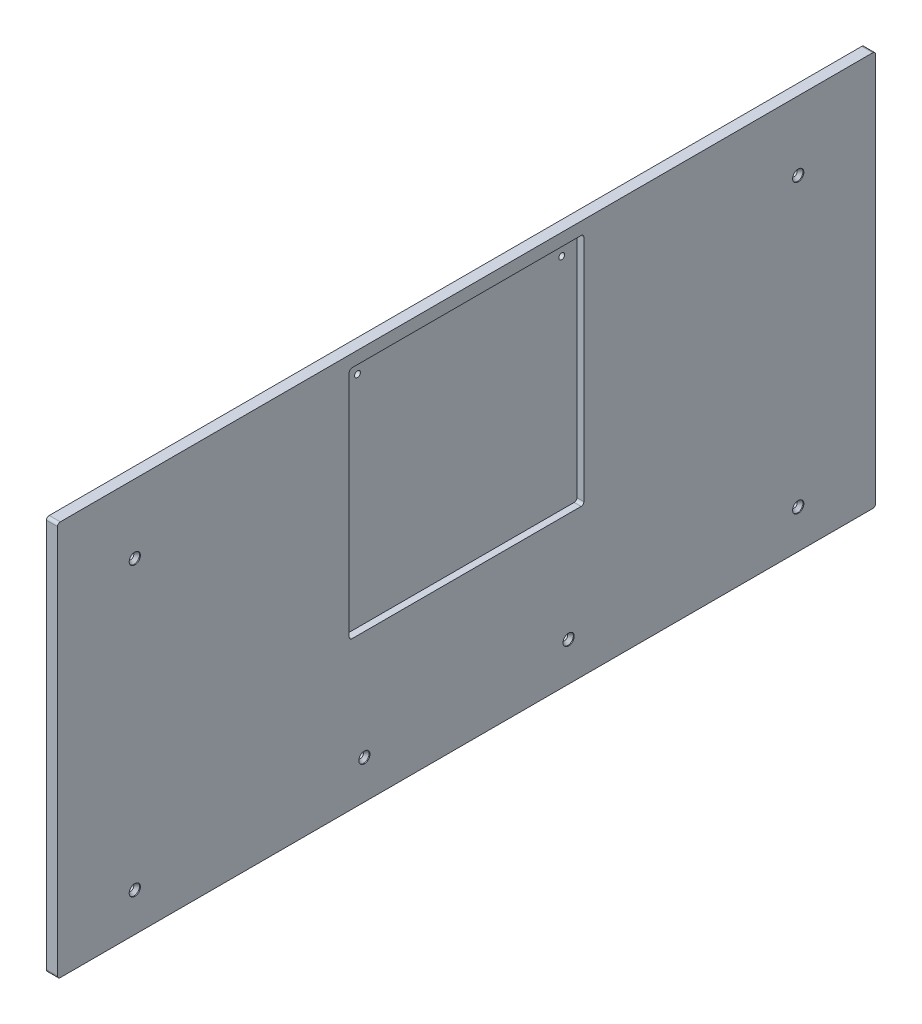
ISO-10303-21;
HEADER;
FILE_DESCRIPTION(('STEP AP214'),'2;1');
FILE_NAME('part.step','',(''),(''),'','','');
FILE_SCHEMA(('AUTOMOTIVE_DESIGN { 1 0 10303 214 1 1 1 1 }'));
ENDSEC;
DATA;
#1=APPLICATION_CONTEXT('core data for automotive mechanical design processes');
#2=APPLICATION_PROTOCOL_DEFINITION('international standard','automotive_design',2000,#1);
#3=PRODUCT_CONTEXT('',#1,'mechanical');
#4=PRODUCT('Part','Part','',(#3));
#5=PRODUCT_RELATED_PRODUCT_CATEGORY('part','',(#4));
#6=PRODUCT_DEFINITION_FORMATION('','',#4);
#7=PRODUCT_DEFINITION_CONTEXT('part definition',#1,'design');
#8=PRODUCT_DEFINITION('design','',#6,#7);
#9=PRODUCT_DEFINITION_SHAPE('','',#8);
#10=(LENGTH_UNIT() NAMED_UNIT(*) SI_UNIT(.MILLI.,.METRE.));
#11=(NAMED_UNIT(*) PLANE_ANGLE_UNIT() SI_UNIT($,.RADIAN.));
#12=(NAMED_UNIT(*) SI_UNIT($,.STERADIAN.) SOLID_ANGLE_UNIT());
#13=UNCERTAINTY_MEASURE_WITH_UNIT(LENGTH_MEASURE(1.E-05),#10,'distance_accuracy_value','');
#14=(GEOMETRIC_REPRESENTATION_CONTEXT(3) GLOBAL_UNCERTAINTY_ASSIGNED_CONTEXT((#13)) GLOBAL_UNIT_ASSIGNED_CONTEXT((#10,
#11,#12)) REPRESENTATION_CONTEXT('',''));
#15=CARTESIAN_POINT('',(0.,0.,0.));
#16=DIRECTION('',(0.,0.,1.));
#17=DIRECTION('',(1.,0.,0.));
#18=AXIS2_PLACEMENT_3D('',#15,#16,#17);
#19=CARTESIAN_POINT('',(0.,0.,0.));
#20=DIRECTION('',(-1.,0.,0.));
#21=DIRECTION('',(0.,0.,1.));
#22=AXIS2_PLACEMENT_3D('',#19,#20,#21);
#23=PLANE('',#22);
#24=CARTESIAN_POINT('',(0.,374.65,-88.9));
#25=DIRECTION('',(1.,0.,0.));
#26=DIRECTION('',(0.,0.,-1.));
#27=AXIS2_PLACEMENT_3D('',#24,#25,#26);
#28=CIRCLE('',#27,3.3782);
#29=CARTESIAN_POINT('',(0.,374.65,-92.2782));
#30=VERTEX_POINT('',#29);
#31=EDGE_CURVE('E516',#30,#30,#28,.T.);
#32=ORIENTED_EDGE('',*,*,#31,.T.);
#33=EDGE_LOOP('',(#32));
#34=FACE_BOUND('',#33,.T.);
#35=CARTESIAN_POINT('',(0.,374.65,-851.98204));
#36=DIRECTION('',(1.,0.,0.));
#37=DIRECTION('',(0.,0.,-1.));
#38=AXIS2_PLACEMENT_3D('',#35,#36,#37);
#39=CIRCLE('',#38,3.3782);
#40=CARTESIAN_POINT('',(0.,374.65,-855.36024));
#41=VERTEX_POINT('',#40);
#42=EDGE_CURVE('E531',#41,#41,#39,.T.);
#43=ORIENTED_EDGE('',*,*,#42,.T.);
#44=EDGE_LOOP('',(#43));
#45=FACE_BOUND('',#44,.T.);
#46=CARTESIAN_POINT('',(0.,44.45,-88.9));
#47=DIRECTION('',(1.,0.,0.));
#48=DIRECTION('',(0.,0.,-1.));
#49=AXIS2_PLACEMENT_3D('',#46,#47,#48);
#50=CIRCLE('',#49,3.3782);
#51=CARTESIAN_POINT('',(0.,44.45,-92.2782));
#52=VERTEX_POINT('',#51);
#53=EDGE_CURVE('E547',#52,#52,#50,.T.);
#54=ORIENTED_EDGE('',*,*,#53,.T.);
#55=EDGE_LOOP('',(#54));
#56=FACE_BOUND('',#55,.T.);
#57=CARTESIAN_POINT('',(0.,44.45,-352.96602));
#58=DIRECTION('',(1.,0.,0.));
#59=DIRECTION('',(0.,0.,-1.));
#60=AXIS2_PLACEMENT_3D('',#57,#58,#59);
#61=CIRCLE('',#60,3.3782);
#62=CARTESIAN_POINT('',(0.,44.45,-356.34422));
#63=VERTEX_POINT('',#62);
#64=EDGE_CURVE('E563',#63,#63,#61,.T.);
#65=ORIENTED_EDGE('',*,*,#64,.T.);
#66=EDGE_LOOP('',(#65));
#67=FACE_BOUND('',#66,.T.);
#68=CARTESIAN_POINT('',(0.,422.275,-587.91602));
#69=DIRECTION('',(1.,0.,0.));
#70=DIRECTION('',(0.,0.,-1.));
#71=AXIS2_PLACEMENT_3D('',#68,#69,#70);
#72=CIRCLE('',#71,3.37343749999991);
#73=CARTESIAN_POINT('',(0.,422.275,-591.2894575));
#74=VERTEX_POINT('',#73);
#75=EDGE_CURVE('E345',#74,#74,#72,.T.);
#76=ORIENTED_EDGE('',*,*,#75,.T.);
#77=EDGE_LOOP('',(#76));
#78=FACE_BOUND('',#77,.T.);
#79=DIRECTION('',(0.,0.,1.));
#80=VECTOR('',#79,1.);
#81=CARTESIAN_POINT('',(0.,454.025,0.));
#82=LINE('',#81,#80);
#83=CARTESIAN_POINT('',(0.,454.025,-937.70704));
#84=VERTEX_POINT('',#83);
#85=CARTESIAN_POINT('',(0.,454.025,-3.175));
#86=VERTEX_POINT('',#85);
#87=EDGE_CURVE('E176',#84,#86,#82,.T.);
#88=ORIENTED_EDGE('',*,*,#87,.F.);
#89=CARTESIAN_POINT('',(0.,450.85,-937.70704));
#90=DIRECTION('',(-1.,0.,0.));
#91=DIRECTION('',(0.,0.,1.));
#92=AXIS2_PLACEMENT_3D('',#89,#90,#91);
#93=CIRCLE('',#92,3.175);
#94=CARTESIAN_POINT('',(0.,450.85,-940.88204));
#95=VERTEX_POINT('',#94);
#96=EDGE_CURVE('E158',#84,#95,#93,.T.);
#97=ORIENTED_EDGE('',*,*,#96,.T.);
#98=DIRECTION('',(0.,1.,0.));
#99=VECTOR('',#98,1.);
#100=CARTESIAN_POINT('',(0.,0.,-940.88204));
#101=LINE('',#100,#99);
#102=CARTESIAN_POINT('',(0.,3.175,-940.88204));
#103=VERTEX_POINT('',#102);
#104=EDGE_CURVE('E188',#103,#95,#101,.T.);
#105=ORIENTED_EDGE('',*,*,#104,.F.);
#106=CARTESIAN_POINT('',(0.,3.175,-937.70704));
#107=DIRECTION('',(-1.,0.,0.));
#108=DIRECTION('',(0.,0.,1.));
#109=AXIS2_PLACEMENT_3D('',#106,#107,#108);
#110=CIRCLE('',#109,3.175);
#111=CARTESIAN_POINT('',(0.,0.,-937.70704));
#112=VERTEX_POINT('',#111);
#113=EDGE_CURVE('E170',#103,#112,#110,.T.);
#114=ORIENTED_EDGE('',*,*,#113,.T.);
#115=DIRECTION('',(0.,0.,-1.));
#116=VECTOR('',#115,1.);
#117=CARTESIAN_POINT('',(0.,0.,0.));
#118=LINE('',#117,#116);
#119=CARTESIAN_POINT('',(0.,0.,-3.175));
#120=VERTEX_POINT('',#119);
#121=EDGE_CURVE('E196',#120,#112,#118,.T.);
#122=ORIENTED_EDGE('',*,*,#121,.F.);
#123=CARTESIAN_POINT('',(0.,3.175,-3.175));
#124=DIRECTION('',(-1.,0.,0.));
#125=DIRECTION('',(0.,0.,1.));
#126=AXIS2_PLACEMENT_3D('',#123,#124,#125);
#127=CIRCLE('',#126,3.175);
#128=CARTESIAN_POINT('',(0.,3.175,0.));
#129=VERTEX_POINT('',#128);
#130=EDGE_CURVE('E204',#120,#129,#127,.T.);
#131=ORIENTED_EDGE('',*,*,#130,.T.);
#132=DIRECTION('',(0.,-1.,0.));
#133=VECTOR('',#132,1.);
#134=CARTESIAN_POINT('',(0.,0.,0.));
#135=LINE('',#134,#133);
#136=CARTESIAN_POINT('',(0.,450.85,0.));
#137=VERTEX_POINT('',#136);
#138=EDGE_CURVE('E352',#137,#129,#135,.T.);
#139=ORIENTED_EDGE('',*,*,#138,.F.);
#140=CARTESIAN_POINT('',(0.,450.85,-3.175));
#141=DIRECTION('',(-1.,0.,0.));
#142=DIRECTION('',(0.,0.,1.));
#143=AXIS2_PLACEMENT_3D('',#140,#141,#142);
#144=CIRCLE('',#143,3.175);
#145=EDGE_CURVE('E181',#137,#86,#144,.T.);
#146=ORIENTED_EDGE('',*,*,#145,.T.);
#147=EDGE_LOOP('',(#88,#97,#105,#114,#122,#131,#139,#146));
#148=FACE_BOUND('',#147,.T.);
#149=CARTESIAN_POINT('',(0.,422.275,-352.96602));
#150=DIRECTION('',(1.,0.,0.));
#151=DIRECTION('',(0.,0.,-1.));
#152=AXIS2_PLACEMENT_3D('',#149,#150,#151);
#153=CIRCLE('',#152,3.37343750000003);
#154=CARTESIAN_POINT('',(0.,422.275,-356.3394575));
#155=VERTEX_POINT('',#154);
#156=EDGE_CURVE('E349',#155,#155,#153,.T.);
#157=ORIENTED_EDGE('',*,*,#156,.T.);
#158=EDGE_LOOP('',(#157));
#159=FACE_BOUND('',#158,.T.);
#160=CARTESIAN_POINT('',(0.,44.45,-851.98204));
#161=DIRECTION('',(1.,0.,0.));
#162=DIRECTION('',(0.,0.,-1.));
#163=AXIS2_PLACEMENT_3D('',#160,#161,#162);
#164=CIRCLE('',#163,3.3782);
#165=CARTESIAN_POINT('',(0.,44.45,-855.36024));
#166=VERTEX_POINT('',#165);
#167=EDGE_CURVE('E304',#166,#166,#164,.T.);
#168=ORIENTED_EDGE('',*,*,#167,.T.);
#169=EDGE_LOOP('',(#168));
#170=FACE_BOUND('',#169,.T.);
#171=CARTESIAN_POINT('',(0.,44.45,-587.91602));
#172=DIRECTION('',(1.,0.,0.));
#173=DIRECTION('',(0.,0.,-1.));
#174=AXIS2_PLACEMENT_3D('',#171,#172,#173);
#175=CIRCLE('',#174,3.3782);
#176=CARTESIAN_POINT('',(0.,44.45,-591.29422));
#177=VERTEX_POINT('',#176);
#178=EDGE_CURVE('E579',#177,#177,#175,.T.);
#179=ORIENTED_EDGE('',*,*,#178,.T.);
#180=EDGE_LOOP('',(#179));
#181=FACE_BOUND('',#180,.T.);
#182=ADVANCED_FACE('F45',(#34,#45,#56,#67,#78,#148,#159,#170,#181),#23,.T.);
#183=CARTESIAN_POINT('',(12.7,422.275,-352.96602));
#184=DIRECTION('',(-1.,0.,0.));
#185=DIRECTION('',(0.,0.,1.));
#186=AXIS2_PLACEMENT_3D('',#183,#184,#185);
#187=CYLINDRICAL_SURFACE('',#186,3.37343750000003);
#188=ORIENTED_EDGE('',*,*,#156,.F.);
#189=EDGE_LOOP('',(#188));
#190=FACE_BOUND('',#189,.T.);
#191=CARTESIAN_POINT('',(4.7625,422.275,-352.96602));
#192=DIRECTION('',(1.,0.,0.));
#193=DIRECTION('',(0.,0.,-1.));
#194=AXIS2_PLACEMENT_3D('',#191,#192,#193);
#195=CIRCLE('',#194,3.37343750000003);
#196=CARTESIAN_POINT('',(4.7625,422.275,-356.3394575));
#197=VERTEX_POINT('',#196);
#198=EDGE_CURVE('E245',#197,#197,#195,.T.);
#199=ORIENTED_EDGE('',*,*,#198,.T.);
#200=EDGE_LOOP('',(#199));
#201=FACE_BOUND('',#200,.T.);
#202=ADVANCED_FACE('F391',(#190,#201),#187,.F.);
#203=CARTESIAN_POINT('',(12.7,422.275,-587.91602));
#204=DIRECTION('',(-1.,0.,0.));
#205=DIRECTION('',(0.,0.,1.));
#206=AXIS2_PLACEMENT_3D('',#203,#204,#205);
#207=CYLINDRICAL_SURFACE('',#206,3.37343749999991);
#208=ORIENTED_EDGE('',*,*,#75,.F.);
#209=EDGE_LOOP('',(#208));
#210=FACE_BOUND('',#209,.T.);
#211=CARTESIAN_POINT('',(4.7625,422.275,-587.91602));
#212=DIRECTION('',(1.,0.,0.));
#213=DIRECTION('',(0.,0.,-1.));
#214=AXIS2_PLACEMENT_3D('',#211,#212,#213);
#215=CIRCLE('',#214,3.37343749999991);
#216=CARTESIAN_POINT('',(4.7625,422.275,-591.2894575));
#217=VERTEX_POINT('',#216);
#218=EDGE_CURVE('E241',#217,#217,#215,.T.);
#219=ORIENTED_EDGE('',*,*,#218,.T.);
#220=EDGE_LOOP('',(#219));
#221=FACE_BOUND('',#220,.T.);
#222=ADVANCED_FACE('F397',(#210,#221),#207,.F.);
#223=CARTESIAN_POINT('',(12.7,0.,0.));
#224=DIRECTION('',(-1.,0.,0.));
#225=DIRECTION('',(0.,0.,1.));
#226=AXIS2_PLACEMENT_3D('',#223,#224,#225);
#227=PLANE('',#226);
#228=CARTESIAN_POINT('',(12.7,374.65,-88.9));
#229=DIRECTION('',(1.,0.,0.));
#230=DIRECTION('',(0.,0.,-1.));
#231=AXIS2_PLACEMENT_3D('',#228,#229,#230);
#232=CIRCLE('',#231,6.43890000000003);
#233=CARTESIAN_POINT('',(12.7,374.65,-95.3389));
#234=VERTEX_POINT('',#233);
#235=EDGE_CURVE('E505',#234,#234,#232,.T.);
#236=ORIENTED_EDGE('',*,*,#235,.F.);
#237=EDGE_LOOP('',(#236));
#238=FACE_BOUND('',#237,.T.);
#239=CARTESIAN_POINT('',(12.7,374.65,-851.98204));
#240=DIRECTION('',(1.,0.,0.));
#241=DIRECTION('',(0.,0.,-1.));
#242=AXIS2_PLACEMENT_3D('',#239,#240,#241);
#243=CIRCLE('',#242,6.43890000000003);
#244=CARTESIAN_POINT('',(12.7,374.65,-858.42094));
#245=VERTEX_POINT('',#244);
#246=EDGE_CURVE('E519',#245,#245,#243,.T.);
#247=ORIENTED_EDGE('',*,*,#246,.F.);
#248=EDGE_LOOP('',(#247));
#249=FACE_BOUND('',#248,.T.);
#250=CARTESIAN_POINT('',(12.7,44.45,-88.9));
#251=DIRECTION('',(1.,0.,0.));
#252=DIRECTION('',(0.,0.,-1.));
#253=AXIS2_PLACEMENT_3D('',#250,#251,#252);
#254=CIRCLE('',#253,6.4389);
#255=CARTESIAN_POINT('',(12.7,44.45,-95.3389));
#256=VERTEX_POINT('',#255);
#257=EDGE_CURVE('E535',#256,#256,#254,.T.);
#258=ORIENTED_EDGE('',*,*,#257,.F.);
#259=EDGE_LOOP('',(#258));
#260=FACE_BOUND('',#259,.T.);
#261=CARTESIAN_POINT('',(12.7,44.45,-352.96602));
#262=DIRECTION('',(1.,0.,0.));
#263=DIRECTION('',(0.,0.,-1.));
#264=AXIS2_PLACEMENT_3D('',#261,#262,#263);
#265=CIRCLE('',#264,6.4389);
#266=CARTESIAN_POINT('',(12.7,44.45,-359.40492));
#267=VERTEX_POINT('',#266);
#268=EDGE_CURVE('E551',#267,#267,#265,.T.);
#269=ORIENTED_EDGE('',*,*,#268,.F.);
#270=EDGE_LOOP('',(#269));
#271=FACE_BOUND('',#270,.T.);
#272=CARTESIAN_POINT('',(12.7,44.45,-587.91602));
#273=DIRECTION('',(1.,0.,0.));
#274=DIRECTION('',(0.,0.,-1.));
#275=AXIS2_PLACEMENT_3D('',#272,#273,#274);
#276=CIRCLE('',#275,6.4389);
#277=CARTESIAN_POINT('',(12.7,44.45,-594.35492));
#278=VERTEX_POINT('',#277);
#279=EDGE_CURVE('E567',#278,#278,#276,.T.);
#280=ORIENTED_EDGE('',*,*,#279,.F.);
#281=EDGE_LOOP('',(#280));
#282=FACE_BOUND('',#281,.T.);
#283=CARTESIAN_POINT('',(12.7,44.45,-851.98204));
#284=DIRECTION('',(1.,0.,0.));
#285=DIRECTION('',(0.,0.,-1.));
#286=AXIS2_PLACEMENT_3D('',#283,#284,#285);
#287=CIRCLE('',#286,6.4389);
#288=CARTESIAN_POINT('',(12.7,44.45,-858.42094));
#289=VERTEX_POINT('',#288);
#290=EDGE_CURVE('E583',#289,#289,#287,.T.);
#291=ORIENTED_EDGE('',*,*,#290,.F.);
#292=EDGE_LOOP('',(#291));
#293=FACE_BOUND('',#292,.T.);
#294=DIRECTION('',(0.,0.,-1.));
#295=VECTOR('',#294,1.);
#296=CARTESIAN_POINT('',(12.7,169.8625,-335.50352));
#297=LINE('',#296,#295);
#298=CARTESIAN_POINT('',(12.7,169.8625,-338.67852));
#299=VERTEX_POINT('',#298);
#300=CARTESIAN_POINT('',(12.7,169.8625,-602.20352));
#301=VERTEX_POINT('',#300);
#302=EDGE_CURVE('E297',#299,#301,#297,.T.);
#303=ORIENTED_EDGE('',*,*,#302,.F.);
#304=CARTESIAN_POINT('',(12.7,173.0375,-338.67852));
#305=DIRECTION('',(-1.,0.,0.));
#306=DIRECTION('',(0.,0.,1.));
#307=AXIS2_PLACEMENT_3D('',#304,#305,#306);
#308=CIRCLE('',#307,3.175);
#309=CARTESIAN_POINT('',(12.7,173.0375,-335.50352));
#310=VERTEX_POINT('',#309);
#311=EDGE_CURVE('E54',#299,#310,#308,.T.);
#312=ORIENTED_EDGE('',*,*,#311,.T.);
#313=DIRECTION('',(0.,-1.,0.));
#314=VECTOR('',#313,1.);
#315=CARTESIAN_POINT('',(12.7,439.7375,-335.50352));
#316=LINE('',#315,#314);
#317=CARTESIAN_POINT('',(12.7,436.5625,-335.50352));
#318=VERTEX_POINT('',#317);
#319=EDGE_CURVE('E296',#318,#310,#316,.T.);
#320=ORIENTED_EDGE('',*,*,#319,.F.);
#321=CARTESIAN_POINT('',(12.7,436.5625,-338.67852));
#322=DIRECTION('',(-1.,0.,0.));
#323=DIRECTION('',(0.,0.,1.));
#324=AXIS2_PLACEMENT_3D('',#321,#322,#323);
#325=CIRCLE('',#324,3.175);
#326=CARTESIAN_POINT('',(12.7,439.7375,-338.67852));
#327=VERTEX_POINT('',#326);
#328=EDGE_CURVE('E285',#318,#327,#325,.T.);
#329=ORIENTED_EDGE('',*,*,#328,.T.);
#330=DIRECTION('',(0.,0.,1.));
#331=VECTOR('',#330,1.);
#332=CARTESIAN_POINT('',(12.7,439.7375,-335.50352));
#333=LINE('',#332,#331);
#334=CARTESIAN_POINT('',(12.7,439.7375,-602.20352));
#335=VERTEX_POINT('',#334);
#336=EDGE_CURVE('E327',#335,#327,#333,.T.);
#337=ORIENTED_EDGE('',*,*,#336,.F.);
#338=CARTESIAN_POINT('',(12.7,436.5625,-602.20352));
#339=DIRECTION('',(-1.,0.,0.));
#340=DIRECTION('',(0.,0.,1.));
#341=AXIS2_PLACEMENT_3D('',#338,#339,#340);
#342=CIRCLE('',#341,3.175);
#343=CARTESIAN_POINT('',(12.7,436.5625,-605.37852));
#344=VERTEX_POINT('',#343);
#345=EDGE_CURVE('E288',#335,#344,#342,.T.);
#346=ORIENTED_EDGE('',*,*,#345,.T.);
#347=DIRECTION('',(0.,1.,0.));
#348=VECTOR('',#347,1.);
#349=CARTESIAN_POINT('',(12.7,439.7375,-605.37852));
#350=LINE('',#349,#348);
#351=CARTESIAN_POINT('',(12.7,173.0375,-605.37852));
#352=VERTEX_POINT('',#351);
#353=EDGE_CURVE('E335',#352,#344,#350,.T.);
#354=ORIENTED_EDGE('',*,*,#353,.F.);
#355=CARTESIAN_POINT('',(12.7,173.0375,-602.20352));
#356=DIRECTION('',(-1.,0.,0.));
#357=DIRECTION('',(0.,0.,1.));
#358=AXIS2_PLACEMENT_3D('',#355,#356,#357);
#359=CIRCLE('',#358,3.175);
#360=EDGE_CURVE('E11',#352,#301,#359,.T.);
#361=ORIENTED_EDGE('',*,*,#360,.T.);
#362=EDGE_LOOP('',(#303,#312,#320,#329,#337,#346,#354,#361));
#363=FACE_BOUND('',#362,.T.);
#364=DIRECTION('',(0.,1.,0.));
#365=VECTOR('',#364,1.);
#366=CARTESIAN_POINT('',(12.7,0.,-940.88204));
#367=LINE('',#366,#365);
#368=CARTESIAN_POINT('',(12.7,3.175,-940.88204));
#369=VERTEX_POINT('',#368);
#370=CARTESIAN_POINT('',(12.7,450.85,-940.88204));
#371=VERTEX_POINT('',#370);
#372=EDGE_CURVE('E357',#369,#371,#367,.T.);
#373=ORIENTED_EDGE('',*,*,#372,.T.);
#374=CARTESIAN_POINT('',(12.7,450.85,-937.70704));
#375=DIRECTION('',(-1.,0.,0.));
#376=DIRECTION('',(0.,0.,1.));
#377=AXIS2_PLACEMENT_3D('',#374,#375,#376);
#378=CIRCLE('',#377,3.175);
#379=CARTESIAN_POINT('',(12.7,454.025,-937.70704));
#380=VERTEX_POINT('',#379);
#381=EDGE_CURVE('E223',#371,#380,#378,.F.);
#382=ORIENTED_EDGE('',*,*,#381,.T.);
#383=DIRECTION('',(0.,0.,1.));
#384=VECTOR('',#383,1.);
#385=CARTESIAN_POINT('',(12.7,454.025,0.));
#386=LINE('',#385,#384);
#387=CARTESIAN_POINT('',(12.7,454.025,-3.175));
#388=VERTEX_POINT('',#387);
#389=EDGE_CURVE('E179',#380,#388,#386,.T.);
#390=ORIENTED_EDGE('',*,*,#389,.T.);
#391=CARTESIAN_POINT('',(12.7,450.85,-3.175));
#392=DIRECTION('',(-1.,0.,0.));
#393=DIRECTION('',(0.,0.,1.));
#394=AXIS2_PLACEMENT_3D('',#391,#392,#393);
#395=CIRCLE('',#394,3.175);
#396=CARTESIAN_POINT('',(12.7,450.85,0.));
#397=VERTEX_POINT('',#396);
#398=EDGE_CURVE('E214',#388,#397,#395,.F.);
#399=ORIENTED_EDGE('',*,*,#398,.T.);
#400=DIRECTION('',(0.,-1.,0.));
#401=VECTOR('',#400,1.);
#402=CARTESIAN_POINT('',(12.7,0.,0.));
#403=LINE('',#402,#401);
#404=CARTESIAN_POINT('',(12.7,3.175,0.));
#405=VERTEX_POINT('',#404);
#406=EDGE_CURVE('E187',#397,#405,#403,.T.);
#407=ORIENTED_EDGE('',*,*,#406,.T.);
#408=CARTESIAN_POINT('',(12.7,3.175,-3.175));
#409=DIRECTION('',(-1.,0.,0.));
#410=DIRECTION('',(0.,0.,1.));
#411=AXIS2_PLACEMENT_3D('',#408,#409,#410);
#412=CIRCLE('',#411,3.175);
#413=CARTESIAN_POINT('',(12.7,0.,-3.175));
#414=VERTEX_POINT('',#413);
#415=EDGE_CURVE('E217',#405,#414,#412,.F.);
#416=ORIENTED_EDGE('',*,*,#415,.T.);
#417=DIRECTION('',(0.,0.,-1.));
#418=VECTOR('',#417,1.);
#419=CARTESIAN_POINT('',(12.7,0.,0.));
#420=LINE('',#419,#418);
#421=CARTESIAN_POINT('',(12.7,0.,-937.70704));
#422=VERTEX_POINT('',#421);
#423=EDGE_CURVE('E194',#414,#422,#420,.T.);
#424=ORIENTED_EDGE('',*,*,#423,.T.);
#425=CARTESIAN_POINT('',(12.7,3.175,-937.70704));
#426=DIRECTION('',(-1.,0.,0.));
#427=DIRECTION('',(0.,0.,1.));
#428=AXIS2_PLACEMENT_3D('',#425,#426,#427);
#429=CIRCLE('',#428,3.175);
#430=EDGE_CURVE('E220',#422,#369,#429,.F.);
#431=ORIENTED_EDGE('',*,*,#430,.T.);
#432=EDGE_LOOP('',(#373,#382,#390,#399,#407,#416,#424,#431));
#433=FACE_BOUND('',#432,.T.);
#434=ADVANCED_FACE('F294',(#238,#249,#260,#271,#282,#293,#363,#433),#227,.F.);
#435=CARTESIAN_POINT('',(12.7,0.,0.));
#436=DIRECTION('',(0.,0.,-1.));
#437=DIRECTION('',(-1.,0.,0.));
#438=AXIS2_PLACEMENT_3D('',#435,#436,#437);
#439=PLANE('',#438);
#440=ORIENTED_EDGE('',*,*,#138,.T.);
#441=DIRECTION('',(-1.,0.,0.));
#442=VECTOR('',#441,1.);
#443=CARTESIAN_POINT('',(12.7,3.175,0.));
#444=LINE('',#443,#442);
#445=EDGE_CURVE('E237',#129,#405,#444,.F.);
#446=ORIENTED_EDGE('',*,*,#445,.T.);
#447=ORIENTED_EDGE('',*,*,#406,.F.);
#448=DIRECTION('',(-1.,0.,0.));
#449=VECTOR('',#448,1.);
#450=CARTESIAN_POINT('',(12.7,450.85,0.));
#451=LINE('',#450,#449);
#452=EDGE_CURVE('E233',#397,#137,#451,.T.);
#453=ORIENTED_EDGE('',*,*,#452,.T.);
#454=EDGE_LOOP('',(#440,#446,#447,#453));
#455=FACE_BOUND('',#454,.T.);
#456=ADVANCED_FACE('F388',(#455),#439,.F.);
#457=CARTESIAN_POINT('',(12.7,0.,0.));
#458=DIRECTION('',(0.,1.,0.));
#459=DIRECTION('',(0.,0.,1.));
#460=AXIS2_PLACEMENT_3D('',#457,#458,#459);
#461=PLANE('',#460);
#462=ORIENTED_EDGE('',*,*,#121,.T.);
#463=DIRECTION('',(-1.,0.,0.));
#464=VECTOR('',#463,1.);
#465=CARTESIAN_POINT('',(12.7,0.,-937.70704));
#466=LINE('',#465,#464);
#467=EDGE_CURVE('E230',#112,#422,#466,.F.);
#468=ORIENTED_EDGE('',*,*,#467,.T.);
#469=ORIENTED_EDGE('',*,*,#423,.F.);
#470=DIRECTION('',(-1.,0.,0.));
#471=VECTOR('',#470,1.);
#472=CARTESIAN_POINT('',(12.7,0.,-3.175));
#473=LINE('',#472,#471);
#474=EDGE_CURVE('E226',#414,#120,#473,.T.);
#475=ORIENTED_EDGE('',*,*,#474,.T.);
#476=EDGE_LOOP('',(#462,#468,#469,#475));
#477=FACE_BOUND('',#476,.T.);
#478=ADVANCED_FACE('F371',(#477),#461,.F.);
#479=CARTESIAN_POINT('',(12.7,0.,-940.88204));
#480=DIRECTION('',(0.,0.,1.));
#481=DIRECTION('',(1.,0.,0.));
#482=AXIS2_PLACEMENT_3D('',#479,#480,#481);
#483=PLANE('',#482);
#484=ORIENTED_EDGE('',*,*,#104,.T.);
#485=DIRECTION('',(-1.,0.,0.));
#486=VECTOR('',#485,1.);
#487=CARTESIAN_POINT('',(12.7,450.85,-940.88204));
#488=LINE('',#487,#486);
#489=EDGE_CURVE('E163',#95,#371,#488,.F.);
#490=ORIENTED_EDGE('',*,*,#489,.T.);
#491=ORIENTED_EDGE('',*,*,#372,.F.);
#492=DIRECTION('',(-1.,0.,0.));
#493=VECTOR('',#492,1.);
#494=CARTESIAN_POINT('',(12.7,3.175,-940.88204));
#495=LINE('',#494,#493);
#496=EDGE_CURVE('E169',#369,#103,#495,.T.);
#497=ORIENTED_EDGE('',*,*,#496,.T.);
#498=EDGE_LOOP('',(#484,#490,#491,#497));
#499=FACE_BOUND('',#498,.T.);
#500=ADVANCED_FACE('F380',(#499),#483,.F.);
#501=CARTESIAN_POINT('',(12.7,454.025,0.));
#502=DIRECTION('',(0.,-1.,0.));
#503=DIRECTION('',(0.,0.,-1.));
#504=AXIS2_PLACEMENT_3D('',#501,#502,#503);
#505=PLANE('',#504);
#506=ORIENTED_EDGE('',*,*,#389,.F.);
#507=DIRECTION('',(-1.,0.,0.));
#508=VECTOR('',#507,1.);
#509=CARTESIAN_POINT('',(12.7,454.025,-937.70704));
#510=LINE('',#509,#508);
#511=EDGE_CURVE('E162',#380,#84,#510,.T.);
#512=ORIENTED_EDGE('',*,*,#511,.T.);
#513=ORIENTED_EDGE('',*,*,#87,.T.);
#514=DIRECTION('',(-1.,0.,0.));
#515=VECTOR('',#514,1.);
#516=CARTESIAN_POINT('',(12.7,454.025,-3.175));
#517=LINE('',#516,#515);
#518=EDGE_CURVE('E182',#86,#388,#517,.F.);
#519=ORIENTED_EDGE('',*,*,#518,.T.);
#520=EDGE_LOOP('',(#506,#512,#513,#519));
#521=FACE_BOUND('',#520,.T.);
#522=ADVANCED_FACE('F175',(#521),#505,.F.);
#523=CARTESIAN_POINT('',(12.7,450.85,-937.70704));
#524=DIRECTION('',(-1.,0.,0.));
#525=DIRECTION('',(0.,0.,1.));
#526=AXIS2_PLACEMENT_3D('',#523,#524,#525);
#527=CYLINDRICAL_SURFACE('',#526,3.175);
#528=ORIENTED_EDGE('',*,*,#381,.F.);
#529=ORIENTED_EDGE('',*,*,#489,.F.);
#530=ORIENTED_EDGE('',*,*,#96,.F.);
#531=ORIENTED_EDGE('',*,*,#511,.F.);
#532=EDGE_LOOP('',(#528,#529,#530,#531));
#533=FACE_BOUND('',#532,.T.);
#534=ADVANCED_FACE('F161',(#533),#527,.T.);
#535=CARTESIAN_POINT('',(12.7,3.175,-937.70704));
#536=DIRECTION('',(-1.,0.,0.));
#537=DIRECTION('',(0.,0.,1.));
#538=AXIS2_PLACEMENT_3D('',#535,#536,#537);
#539=CYLINDRICAL_SURFACE('',#538,3.175);
#540=ORIENTED_EDGE('',*,*,#430,.F.);
#541=ORIENTED_EDGE('',*,*,#467,.F.);
#542=ORIENTED_EDGE('',*,*,#113,.F.);
#543=ORIENTED_EDGE('',*,*,#496,.F.);
#544=EDGE_LOOP('',(#540,#541,#542,#543));
#545=FACE_BOUND('',#544,.T.);
#546=ADVANCED_FACE('F376',(#545),#539,.T.);
#547=CARTESIAN_POINT('',(12.7,3.175,-3.175));
#548=DIRECTION('',(-1.,0.,0.));
#549=DIRECTION('',(0.,0.,1.));
#550=AXIS2_PLACEMENT_3D('',#547,#548,#549);
#551=CYLINDRICAL_SURFACE('',#550,3.175);
#552=ORIENTED_EDGE('',*,*,#415,.F.);
#553=ORIENTED_EDGE('',*,*,#445,.F.);
#554=ORIENTED_EDGE('',*,*,#130,.F.);
#555=ORIENTED_EDGE('',*,*,#474,.F.);
#556=EDGE_LOOP('',(#552,#553,#554,#555));
#557=FACE_BOUND('',#556,.T.);
#558=ADVANCED_FACE('F799',(#557),#551,.T.);
#559=CARTESIAN_POINT('',(12.7,450.85,-3.175));
#560=DIRECTION('',(-1.,0.,0.));
#561=DIRECTION('',(0.,0.,1.));
#562=AXIS2_PLACEMENT_3D('',#559,#560,#561);
#563=CYLINDRICAL_SURFACE('',#562,3.175);
#564=ORIENTED_EDGE('',*,*,#398,.F.);
#565=ORIENTED_EDGE('',*,*,#518,.F.);
#566=ORIENTED_EDGE('',*,*,#145,.F.);
#567=ORIENTED_EDGE('',*,*,#452,.F.);
#568=EDGE_LOOP('',(#564,#565,#566,#567));
#569=FACE_BOUND('',#568,.T.);
#570=ADVANCED_FACE('F412',(#569),#563,.T.);
#571=CARTESIAN_POINT('',(4.7625,439.7375,-335.50352));
#572=DIRECTION('',(0.,0.,1.));
#573=DIRECTION('',(0.,-1.,0.));
#574=AXIS2_PLACEMENT_3D('',#571,#572,#573);
#575=PLANE('',#574);
#576=DIRECTION('',(0.,-1.,0.));
#577=VECTOR('',#576,1.);
#578=CARTESIAN_POINT('',(4.7625,439.7375,-335.50352));
#579=LINE('',#578,#577);
#580=CARTESIAN_POINT('',(4.7625,436.5625,-335.50352));
#581=VERTEX_POINT('',#580);
#582=CARTESIAN_POINT('',(4.7625,173.0375,-335.50352));
#583=VERTEX_POINT('',#582);
#584=EDGE_CURVE('E315',#581,#583,#579,.T.);
#585=ORIENTED_EDGE('',*,*,#584,.F.);
#586=DIRECTION('',(1.,0.,0.));
#587=VECTOR('',#586,1.);
#588=CARTESIAN_POINT('',(12.7,436.5625,-335.50352));
#589=LINE('',#588,#587);
#590=EDGE_CURVE('E249',#581,#318,#589,.T.);
#591=ORIENTED_EDGE('',*,*,#590,.T.);
#592=ORIENTED_EDGE('',*,*,#319,.T.);
#593=DIRECTION('',(1.,0.,0.));
#594=VECTOR('',#593,1.);
#595=CARTESIAN_POINT('',(4.7625,173.0375,-335.50352));
#596=LINE('',#595,#594);
#597=EDGE_CURVE('E240',#310,#583,#596,.F.);
#598=ORIENTED_EDGE('',*,*,#597,.T.);
#599=EDGE_LOOP('',(#585,#591,#592,#598));
#600=FACE_BOUND('',#599,.T.);
#601=ADVANCED_FACE('F300',(#600),#575,.F.);
#602=CARTESIAN_POINT('',(4.7625,439.7375,-335.50352));
#603=DIRECTION('',(0.,1.,0.));
#604=DIRECTION('',(0.,0.,1.));
#605=AXIS2_PLACEMENT_3D('',#602,#603,#604);
#606=PLANE('',#605);
#607=ORIENTED_EDGE('',*,*,#336,.T.);
#608=DIRECTION('',(1.,0.,0.));
#609=VECTOR('',#608,1.);
#610=CARTESIAN_POINT('',(4.7625,439.7375,-338.67852));
#611=LINE('',#610,#609);
#612=CARTESIAN_POINT('',(4.7625,439.7375,-338.67852));
#613=VERTEX_POINT('',#612);
#614=EDGE_CURVE('E257',#327,#613,#611,.F.);
#615=ORIENTED_EDGE('',*,*,#614,.T.);
#616=DIRECTION('',(0.,0.,1.));
#617=VECTOR('',#616,1.);
#618=CARTESIAN_POINT('',(4.7625,439.7375,-335.50352));
#619=LINE('',#618,#617);
#620=CARTESIAN_POINT('',(4.7625,439.7375,-602.20352));
#621=VERTEX_POINT('',#620);
#622=EDGE_CURVE('E246',#621,#613,#619,.T.);
#623=ORIENTED_EDGE('',*,*,#622,.F.);
#624=DIRECTION('',(1.,0.,0.));
#625=VECTOR('',#624,1.);
#626=CARTESIAN_POINT('',(12.7,439.7375,-602.20352));
#627=LINE('',#626,#625);
#628=EDGE_CURVE('E253',#621,#335,#627,.T.);
#629=ORIENTED_EDGE('',*,*,#628,.T.);
#630=EDGE_LOOP('',(#607,#615,#623,#629));
#631=FACE_BOUND('',#630,.T.);
#632=ADVANCED_FACE('F411',(#631),#606,.F.);
#633=CARTESIAN_POINT('',(4.7625,439.7375,-605.37852));
#634=DIRECTION('',(0.,0.,-1.));
#635=DIRECTION('',(-1.,0.,0.));
#636=AXIS2_PLACEMENT_3D('',#633,#634,#635);
#637=PLANE('',#636);
#638=ORIENTED_EDGE('',*,*,#353,.T.);
#639=DIRECTION('',(1.,0.,0.));
#640=VECTOR('',#639,1.);
#641=CARTESIAN_POINT('',(4.7625,436.5625,-605.37852));
#642=LINE('',#641,#640);
#643=CARTESIAN_POINT('',(4.7625,436.5625,-605.37852));
#644=VERTEX_POINT('',#643);
#645=EDGE_CURVE('E276',#344,#644,#642,.F.);
#646=ORIENTED_EDGE('',*,*,#645,.T.);
#647=DIRECTION('',(0.,1.,0.));
#648=VECTOR('',#647,1.);
#649=CARTESIAN_POINT('',(4.7625,439.7375,-605.37852));
#650=LINE('',#649,#648);
#651=CARTESIAN_POINT('',(4.7625,173.0375,-605.37852));
#652=VERTEX_POINT('',#651);
#653=EDGE_CURVE('E320',#652,#644,#650,.T.);
#654=ORIENTED_EDGE('',*,*,#653,.F.);
#655=DIRECTION('',(1.,0.,0.));
#656=VECTOR('',#655,1.);
#657=CARTESIAN_POINT('',(12.7,173.0375,-605.37852));
#658=LINE('',#657,#656);
#659=EDGE_CURVE('E272',#652,#352,#658,.T.);
#660=ORIENTED_EDGE('',*,*,#659,.T.);
#661=EDGE_LOOP('',(#638,#646,#654,#660));
#662=FACE_BOUND('',#661,.T.);
#663=ADVANCED_FACE('F415',(#662),#637,.F.);
#664=CARTESIAN_POINT('',(4.7625,169.8625,-335.50352));
#665=DIRECTION('',(0.,-1.,0.));
#666=DIRECTION('',(0.,0.,-1.));
#667=AXIS2_PLACEMENT_3D('',#664,#665,#666);
#668=PLANE('',#667);
#669=DIRECTION('',(0.,0.,-1.));
#670=VECTOR('',#669,1.);
#671=CARTESIAN_POINT('',(4.7625,169.8625,-335.50352));
#672=LINE('',#671,#670);
#673=CARTESIAN_POINT('',(4.7625,169.8625,-338.67852));
#674=VERTEX_POINT('',#673);
#675=CARTESIAN_POINT('',(4.7625,169.8625,-602.20352));
#676=VERTEX_POINT('',#675);
#677=EDGE_CURVE('E313',#674,#676,#672,.T.);
#678=ORIENTED_EDGE('',*,*,#677,.F.);
#679=DIRECTION('',(1.,0.,0.));
#680=VECTOR('',#679,1.);
#681=CARTESIAN_POINT('',(12.7,169.8625,-338.67852));
#682=LINE('',#681,#680);
#683=EDGE_CURVE('E282',#674,#299,#682,.T.);
#684=ORIENTED_EDGE('',*,*,#683,.T.);
#685=ORIENTED_EDGE('',*,*,#302,.T.);
#686=DIRECTION('',(1.,0.,0.));
#687=VECTOR('',#686,1.);
#688=CARTESIAN_POINT('',(4.7625,169.8625,-602.20352));
#689=LINE('',#688,#687);
#690=EDGE_CURVE('E279',#301,#676,#689,.F.);
#691=ORIENTED_EDGE('',*,*,#690,.T.);
#692=EDGE_LOOP('',(#678,#684,#685,#691));
#693=FACE_BOUND('',#692,.T.);
#694=ADVANCED_FACE('F317',(#693),#668,.F.);
#695=CARTESIAN_POINT('',(4.7625,0.,0.));
#696=DIRECTION('',(1.,0.,0.));
#697=DIRECTION('',(0.,0.,-1.));
#698=AXIS2_PLACEMENT_3D('',#695,#696,#697);
#699=PLANE('',#698);
#700=ORIENTED_EDGE('',*,*,#198,.F.);
#701=EDGE_LOOP('',(#700));
#702=FACE_BOUND('',#701,.T.);
#703=ORIENTED_EDGE('',*,*,#218,.F.);
#704=EDGE_LOOP('',(#703));
#705=FACE_BOUND('',#704,.T.);
#706=ORIENTED_EDGE('',*,*,#622,.T.);
#707=CARTESIAN_POINT('',(4.7625,436.5625,-338.67852));
#708=DIRECTION('',(1.,0.,0.));
#709=DIRECTION('',(0.,0.,-1.));
#710=AXIS2_PLACEMENT_3D('',#707,#708,#709);
#711=CIRCLE('',#710,3.175);
#712=EDGE_CURVE('E269',#613,#581,#711,.T.);
#713=ORIENTED_EDGE('',*,*,#712,.T.);
#714=ORIENTED_EDGE('',*,*,#584,.T.);
#715=CARTESIAN_POINT('',(4.7625,173.0375,-338.67852));
#716=DIRECTION('',(1.,0.,0.));
#717=DIRECTION('',(0.,0.,-1.));
#718=AXIS2_PLACEMENT_3D('',#715,#716,#717);
#719=CIRCLE('',#718,3.175);
#720=EDGE_CURVE('E263',#583,#674,#719,.T.);
#721=ORIENTED_EDGE('',*,*,#720,.T.);
#722=ORIENTED_EDGE('',*,*,#677,.T.);
#723=CARTESIAN_POINT('',(4.7625,173.0375,-602.20352));
#724=DIRECTION('',(1.,0.,0.));
#725=DIRECTION('',(0.,0.,-1.));
#726=AXIS2_PLACEMENT_3D('',#723,#724,#725);
#727=CIRCLE('',#726,3.175);
#728=EDGE_CURVE('E260',#676,#652,#727,.T.);
#729=ORIENTED_EDGE('',*,*,#728,.T.);
#730=ORIENTED_EDGE('',*,*,#653,.T.);
#731=CARTESIAN_POINT('',(4.7625,436.5625,-602.20352));
#732=DIRECTION('',(1.,0.,0.));
#733=DIRECTION('',(0.,0.,-1.));
#734=AXIS2_PLACEMENT_3D('',#731,#732,#733);
#735=CIRCLE('',#734,3.175);
#736=EDGE_CURVE('E266',#644,#621,#735,.T.);
#737=ORIENTED_EDGE('',*,*,#736,.T.);
#738=EDGE_LOOP('',(#706,#713,#714,#721,#722,#729,#730,#737));
#739=FACE_BOUND('',#738,.T.);
#740=ADVANCED_FACE('F312',(#702,#705,#739),#699,.T.);
#741=CARTESIAN_POINT('',(4.7625,436.5625,-338.67852));
#742=DIRECTION('',(-1.,0.,0.));
#743=DIRECTION('',(0.,0.,1.));
#744=AXIS2_PLACEMENT_3D('',#741,#742,#743);
#745=CYLINDRICAL_SURFACE('',#744,3.175);
#746=ORIENTED_EDGE('',*,*,#712,.F.);
#747=ORIENTED_EDGE('',*,*,#614,.F.);
#748=ORIENTED_EDGE('',*,*,#328,.F.);
#749=ORIENTED_EDGE('',*,*,#590,.F.);
#750=EDGE_LOOP('',(#746,#747,#748,#749));
#751=FACE_BOUND('',#750,.T.);
#752=ADVANCED_FACE('F424',(#751),#745,.F.);
#753=CARTESIAN_POINT('',(4.7625,436.5625,-602.20352));
#754=DIRECTION('',(-1.,0.,0.));
#755=DIRECTION('',(0.,0.,1.));
#756=AXIS2_PLACEMENT_3D('',#753,#754,#755);
#757=CYLINDRICAL_SURFACE('',#756,3.175);
#758=ORIENTED_EDGE('',*,*,#736,.F.);
#759=ORIENTED_EDGE('',*,*,#645,.F.);
#760=ORIENTED_EDGE('',*,*,#345,.F.);
#761=ORIENTED_EDGE('',*,*,#628,.F.);
#762=EDGE_LOOP('',(#758,#759,#760,#761));
#763=FACE_BOUND('',#762,.T.);
#764=ADVANCED_FACE('F758',(#763),#757,.F.);
#765=CARTESIAN_POINT('',(4.7625,173.0375,-338.67852));
#766=DIRECTION('',(-1.,0.,0.));
#767=DIRECTION('',(0.,0.,1.));
#768=AXIS2_PLACEMENT_3D('',#765,#766,#767);
#769=CYLINDRICAL_SURFACE('',#768,3.175);
#770=ORIENTED_EDGE('',*,*,#720,.F.);
#771=ORIENTED_EDGE('',*,*,#597,.F.);
#772=ORIENTED_EDGE('',*,*,#311,.F.);
#773=ORIENTED_EDGE('',*,*,#683,.F.);
#774=EDGE_LOOP('',(#770,#771,#772,#773));
#775=FACE_BOUND('',#774,.T.);
#776=ADVANCED_FACE('F307',(#775),#769,.F.);
#777=CARTESIAN_POINT('',(4.7625,173.0375,-602.20352));
#778=DIRECTION('',(-1.,0.,0.));
#779=DIRECTION('',(0.,0.,1.));
#780=AXIS2_PLACEMENT_3D('',#777,#778,#779);
#781=CYLINDRICAL_SURFACE('',#780,3.175);
#782=ORIENTED_EDGE('',*,*,#728,.F.);
#783=ORIENTED_EDGE('',*,*,#690,.F.);
#784=ORIENTED_EDGE('',*,*,#360,.F.);
#785=ORIENTED_EDGE('',*,*,#659,.F.);
#786=EDGE_LOOP('',(#782,#783,#784,#785));
#787=FACE_BOUND('',#786,.T.);
#788=ADVANCED_FACE('F47',(#787),#781,.F.);
#789=CARTESIAN_POINT('',(12.7,44.45,-851.98204));
#790=DIRECTION('',(1.,0.,0.));
#791=DIRECTION('',(0.,0.,-1.));
#792=AXIS2_PLACEMENT_3D('',#789,#790,#791);
#793=CYLINDRICAL_SURFACE('',#792,3.3782);
#794=ORIENTED_EDGE('',*,*,#167,.F.);
#795=EDGE_LOOP('',(#794));
#796=FACE_BOUND('',#795,.T.);
#797=CARTESIAN_POINT('',(8.16306741601866,44.45,-851.98204));
#798=DIRECTION('',(1.,0.,0.));
#799=DIRECTION('',(0.,0.,-1.));
#800=AXIS2_PLACEMENT_3D('',#797,#798,#799);
#801=CIRCLE('',#800,3.3782);
#802=CARTESIAN_POINT('',(8.16306741601866,44.45,-855.36024));
#803=VERTEX_POINT('',#802);
#804=EDGE_CURVE('E591',#803,#803,#801,.T.);
#805=ORIENTED_EDGE('',*,*,#804,.T.);
#806=EDGE_LOOP('',(#805));
#807=FACE_BOUND('',#806,.T.);
#808=ADVANCED_FACE('F426',(#796,#807),#793,.F.);
#809=CARTESIAN_POINT('',(11.684,44.45,-851.98204));
#810=DIRECTION('',(1.,0.,0.));
#811=DIRECTION('',(0.,0.,-1.));
#812=AXIS2_PLACEMENT_3D('',#809,#810,#811);
#813=CONICAL_SURFACE('',#812,6.4389,0.715584993317675);
#814=ORIENTED_EDGE('',*,*,#804,.F.);
#815=EDGE_LOOP('',(#814));
#816=FACE_BOUND('',#815,.T.);
#817=CARTESIAN_POINT('',(11.684,44.45,-851.98204));
#818=DIRECTION('',(1.,0.,0.));
#819=DIRECTION('',(0.,0.,-1.));
#820=AXIS2_PLACEMENT_3D('',#817,#818,#819);
#821=CIRCLE('',#820,6.4389);
#822=CARTESIAN_POINT('',(11.684,44.45,-858.42094));
#823=VERTEX_POINT('',#822);
#824=EDGE_CURVE('E587',#823,#823,#821,.T.);
#825=ORIENTED_EDGE('',*,*,#824,.T.);
#826=EDGE_LOOP('',(#825));
#827=FACE_BOUND('',#826,.T.);
#828=ADVANCED_FACE('F429',(#816,#827),#813,.F.);
#829=CARTESIAN_POINT('',(12.7,44.45,-851.98204));
#830=DIRECTION('',(1.,0.,0.));
#831=DIRECTION('',(0.,0.,-1.));
#832=AXIS2_PLACEMENT_3D('',#829,#830,#831);
#833=CYLINDRICAL_SURFACE('',#832,6.4389);
#834=ORIENTED_EDGE('',*,*,#824,.F.);
#835=EDGE_LOOP('',(#834));
#836=FACE_BOUND('',#835,.T.);
#837=ORIENTED_EDGE('',*,*,#290,.T.);
#838=EDGE_LOOP('',(#837));
#839=FACE_BOUND('',#838,.T.);
#840=ADVANCED_FACE('F433',(#836,#839),#833,.F.);
#841=CARTESIAN_POINT('',(12.7,44.45,-587.91602));
#842=DIRECTION('',(1.,0.,0.));
#843=DIRECTION('',(0.,0.,-1.));
#844=AXIS2_PLACEMENT_3D('',#841,#842,#843);
#845=CYLINDRICAL_SURFACE('',#844,3.3782);
#846=ORIENTED_EDGE('',*,*,#178,.F.);
#847=EDGE_LOOP('',(#846));
#848=FACE_BOUND('',#847,.T.);
#849=CARTESIAN_POINT('',(8.16306741601866,44.45,-587.91602));
#850=DIRECTION('',(1.,0.,0.));
#851=DIRECTION('',(0.,0.,-1.));
#852=AXIS2_PLACEMENT_3D('',#849,#850,#851);
#853=CIRCLE('',#852,3.3782);
#854=CARTESIAN_POINT('',(8.16306741601866,44.45,-591.29422));
#855=VERTEX_POINT('',#854);
#856=EDGE_CURVE('E575',#855,#855,#853,.T.);
#857=ORIENTED_EDGE('',*,*,#856,.T.);
#858=EDGE_LOOP('',(#857));
#859=FACE_BOUND('',#858,.T.);
#860=ADVANCED_FACE('F437',(#848,#859),#845,.F.);
#861=CARTESIAN_POINT('',(11.684,44.45,-587.91602));
#862=DIRECTION('',(1.,0.,0.));
#863=DIRECTION('',(0.,0.,-1.));
#864=AXIS2_PLACEMENT_3D('',#861,#862,#863);
#865=CONICAL_SURFACE('',#864,6.4389,0.715584993317675);
#866=ORIENTED_EDGE('',*,*,#856,.F.);
#867=EDGE_LOOP('',(#866));
#868=FACE_BOUND('',#867,.T.);
#869=CARTESIAN_POINT('',(11.684,44.45,-587.91602));
#870=DIRECTION('',(1.,0.,0.));
#871=DIRECTION('',(0.,0.,-1.));
#872=AXIS2_PLACEMENT_3D('',#869,#870,#871);
#873=CIRCLE('',#872,6.4389);
#874=CARTESIAN_POINT('',(11.684,44.45,-594.35492));
#875=VERTEX_POINT('',#874);
#876=EDGE_CURVE('E571',#875,#875,#873,.T.);
#877=ORIENTED_EDGE('',*,*,#876,.T.);
#878=EDGE_LOOP('',(#877));
#879=FACE_BOUND('',#878,.T.);
#880=ADVANCED_FACE('F441',(#868,#879),#865,.F.);
#881=CARTESIAN_POINT('',(12.7,44.45,-587.91602));
#882=DIRECTION('',(1.,0.,0.));
#883=DIRECTION('',(0.,0.,-1.));
#884=AXIS2_PLACEMENT_3D('',#881,#882,#883);
#885=CYLINDRICAL_SURFACE('',#884,6.4389);
#886=ORIENTED_EDGE('',*,*,#876,.F.);
#887=EDGE_LOOP('',(#886));
#888=FACE_BOUND('',#887,.T.);
#889=ORIENTED_EDGE('',*,*,#279,.T.);
#890=EDGE_LOOP('',(#889));
#891=FACE_BOUND('',#890,.T.);
#892=ADVANCED_FACE('F445',(#888,#891),#885,.F.);
#893=CARTESIAN_POINT('',(12.7,44.45,-352.96602));
#894=DIRECTION('',(1.,0.,0.));
#895=DIRECTION('',(0.,0.,-1.));
#896=AXIS2_PLACEMENT_3D('',#893,#894,#895);
#897=CYLINDRICAL_SURFACE('',#896,3.3782);
#898=ORIENTED_EDGE('',*,*,#64,.F.);
#899=EDGE_LOOP('',(#898));
#900=FACE_BOUND('',#899,.T.);
#901=CARTESIAN_POINT('',(8.16306741601866,44.45,-352.96602));
#902=DIRECTION('',(1.,0.,0.));
#903=DIRECTION('',(0.,0.,-1.));
#904=AXIS2_PLACEMENT_3D('',#901,#902,#903);
#905=CIRCLE('',#904,3.3782);
#906=CARTESIAN_POINT('',(8.16306741601866,44.45,-356.34422));
#907=VERTEX_POINT('',#906);
#908=EDGE_CURVE('E559',#907,#907,#905,.T.);
#909=ORIENTED_EDGE('',*,*,#908,.T.);
#910=EDGE_LOOP('',(#909));
#911=FACE_BOUND('',#910,.T.);
#912=ADVANCED_FACE('F449',(#900,#911),#897,.F.);
#913=CARTESIAN_POINT('',(11.684,44.45,-352.96602));
#914=DIRECTION('',(1.,0.,0.));
#915=DIRECTION('',(0.,0.,-1.));
#916=AXIS2_PLACEMENT_3D('',#913,#914,#915);
#917=CONICAL_SURFACE('',#916,6.4389,0.715584993317675);
#918=ORIENTED_EDGE('',*,*,#908,.F.);
#919=EDGE_LOOP('',(#918));
#920=FACE_BOUND('',#919,.T.);
#921=CARTESIAN_POINT('',(11.684,44.45,-352.96602));
#922=DIRECTION('',(1.,0.,0.));
#923=DIRECTION('',(0.,0.,-1.));
#924=AXIS2_PLACEMENT_3D('',#921,#922,#923);
#925=CIRCLE('',#924,6.4389);
#926=CARTESIAN_POINT('',(11.684,44.45,-359.40492));
#927=VERTEX_POINT('',#926);
#928=EDGE_CURVE('E555',#927,#927,#925,.T.);
#929=ORIENTED_EDGE('',*,*,#928,.T.);
#930=EDGE_LOOP('',(#929));
#931=FACE_BOUND('',#930,.T.);
#932=ADVANCED_FACE('F453',(#920,#931),#917,.F.);
#933=CARTESIAN_POINT('',(12.7,44.45,-352.96602));
#934=DIRECTION('',(1.,0.,0.));
#935=DIRECTION('',(0.,0.,-1.));
#936=AXIS2_PLACEMENT_3D('',#933,#934,#935);
#937=CYLINDRICAL_SURFACE('',#936,6.4389);
#938=ORIENTED_EDGE('',*,*,#928,.F.);
#939=EDGE_LOOP('',(#938));
#940=FACE_BOUND('',#939,.T.);
#941=ORIENTED_EDGE('',*,*,#268,.T.);
#942=EDGE_LOOP('',(#941));
#943=FACE_BOUND('',#942,.T.);
#944=ADVANCED_FACE('F457',(#940,#943),#937,.F.);
#945=CARTESIAN_POINT('',(12.7,44.45,-88.9));
#946=DIRECTION('',(1.,0.,0.));
#947=DIRECTION('',(0.,0.,-1.));
#948=AXIS2_PLACEMENT_3D('',#945,#946,#947);
#949=CYLINDRICAL_SURFACE('',#948,3.3782);
#950=ORIENTED_EDGE('',*,*,#53,.F.);
#951=EDGE_LOOP('',(#950));
#952=FACE_BOUND('',#951,.T.);
#953=CARTESIAN_POINT('',(8.16306741601866,44.45,-88.9));
#954=DIRECTION('',(1.,0.,0.));
#955=DIRECTION('',(0.,0.,-1.));
#956=AXIS2_PLACEMENT_3D('',#953,#954,#955);
#957=CIRCLE('',#956,3.3782);
#958=CARTESIAN_POINT('',(8.16306741601866,44.45,-92.2782));
#959=VERTEX_POINT('',#958);
#960=EDGE_CURVE('E543',#959,#959,#957,.T.);
#961=ORIENTED_EDGE('',*,*,#960,.T.);
#962=EDGE_LOOP('',(#961));
#963=FACE_BOUND('',#962,.T.);
#964=ADVANCED_FACE('F461',(#952,#963),#949,.F.);
#965=CARTESIAN_POINT('',(11.684,44.45,-88.9));
#966=DIRECTION('',(1.,0.,0.));
#967=DIRECTION('',(0.,0.,-1.));
#968=AXIS2_PLACEMENT_3D('',#965,#966,#967);
#969=CONICAL_SURFACE('',#968,6.4389,0.715584993317675);
#970=ORIENTED_EDGE('',*,*,#960,.F.);
#971=EDGE_LOOP('',(#970));
#972=FACE_BOUND('',#971,.T.);
#973=CARTESIAN_POINT('',(11.684,44.45,-88.9));
#974=DIRECTION('',(1.,0.,0.));
#975=DIRECTION('',(0.,0.,-1.));
#976=AXIS2_PLACEMENT_3D('',#973,#974,#975);
#977=CIRCLE('',#976,6.4389);
#978=CARTESIAN_POINT('',(11.684,44.45,-95.3389));
#979=VERTEX_POINT('',#978);
#980=EDGE_CURVE('E539',#979,#979,#977,.T.);
#981=ORIENTED_EDGE('',*,*,#980,.T.);
#982=EDGE_LOOP('',(#981));
#983=FACE_BOUND('',#982,.T.);
#984=ADVANCED_FACE('F465',(#972,#983),#969,.F.);
#985=CARTESIAN_POINT('',(12.7,44.45,-88.9));
#986=DIRECTION('',(1.,0.,0.));
#987=DIRECTION('',(0.,0.,-1.));
#988=AXIS2_PLACEMENT_3D('',#985,#986,#987);
#989=CYLINDRICAL_SURFACE('',#988,6.4389);
#990=ORIENTED_EDGE('',*,*,#980,.F.);
#991=EDGE_LOOP('',(#990));
#992=FACE_BOUND('',#991,.T.);
#993=ORIENTED_EDGE('',*,*,#257,.T.);
#994=EDGE_LOOP('',(#993));
#995=FACE_BOUND('',#994,.T.);
#996=ADVANCED_FACE('F469',(#992,#995),#989,.F.);
#997=CARTESIAN_POINT('',(12.7,374.65,-851.98204));
#998=DIRECTION('',(1.,0.,0.));
#999=DIRECTION('',(0.,0.,-1.));
#1000=AXIS2_PLACEMENT_3D('',#997,#998,#999);
#1001=CYLINDRICAL_SURFACE('',#1000,3.3782);
#1002=ORIENTED_EDGE('',*,*,#42,.F.);
#1003=EDGE_LOOP('',(#1002));
#1004=FACE_BOUND('',#1003,.T.);
#1005=CARTESIAN_POINT('',(8.16306741601866,374.65,-851.98204));
#1006=DIRECTION('',(1.,0.,0.));
#1007=DIRECTION('',(0.,0.,-1.));
#1008=AXIS2_PLACEMENT_3D('',#1005,#1006,#1007);
#1009=CIRCLE('',#1008,3.3782);
#1010=CARTESIAN_POINT('',(8.16306741601866,374.65,-855.36024));
#1011=VERTEX_POINT('',#1010);
#1012=EDGE_CURVE('E527',#1011,#1011,#1009,.T.);
#1013=ORIENTED_EDGE('',*,*,#1012,.T.);
#1014=EDGE_LOOP('',(#1013));
#1015=FACE_BOUND('',#1014,.T.);
#1016=ADVANCED_FACE('F473',(#1004,#1015),#1001,.F.);
#1017=CARTESIAN_POINT('',(11.684,374.65,-851.98204));
#1018=DIRECTION('',(1.,0.,0.));
#1019=DIRECTION('',(0.,0.,-1.));
#1020=AXIS2_PLACEMENT_3D('',#1017,#1018,#1019);
#1021=CONICAL_SURFACE('',#1020,6.43890000000003,0.71558499331768);
#1022=ORIENTED_EDGE('',*,*,#1012,.F.);
#1023=EDGE_LOOP('',(#1022));
#1024=FACE_BOUND('',#1023,.T.);
#1025=CARTESIAN_POINT('',(11.684,374.65,-851.98204));
#1026=DIRECTION('',(1.,0.,0.));
#1027=DIRECTION('',(0.,0.,-1.));
#1028=AXIS2_PLACEMENT_3D('',#1025,#1026,#1027);
#1029=CIRCLE('',#1028,6.43890000000003);
#1030=CARTESIAN_POINT('',(11.684,374.65,-858.42094));
#1031=VERTEX_POINT('',#1030);
#1032=EDGE_CURVE('E523',#1031,#1031,#1029,.T.);
#1033=ORIENTED_EDGE('',*,*,#1032,.T.);
#1034=EDGE_LOOP('',(#1033));
#1035=FACE_BOUND('',#1034,.T.);
#1036=ADVANCED_FACE('F477',(#1024,#1035),#1021,.F.);
#1037=CARTESIAN_POINT('',(12.7,374.65,-851.98204));
#1038=DIRECTION('',(1.,0.,0.));
#1039=DIRECTION('',(0.,0.,-1.));
#1040=AXIS2_PLACEMENT_3D('',#1037,#1038,#1039);
#1041=CYLINDRICAL_SURFACE('',#1040,6.43890000000003);
#1042=ORIENTED_EDGE('',*,*,#1032,.F.);
#1043=EDGE_LOOP('',(#1042));
#1044=FACE_BOUND('',#1043,.T.);
#1045=ORIENTED_EDGE('',*,*,#246,.T.);
#1046=EDGE_LOOP('',(#1045));
#1047=FACE_BOUND('',#1046,.T.);
#1048=ADVANCED_FACE('F481',(#1044,#1047),#1041,.F.);
#1049=CARTESIAN_POINT('',(12.7,374.65,-88.9));
#1050=DIRECTION('',(1.,0.,0.));
#1051=DIRECTION('',(0.,0.,-1.));
#1052=AXIS2_PLACEMENT_3D('',#1049,#1050,#1051);
#1053=CYLINDRICAL_SURFACE('',#1052,3.3782);
#1054=ORIENTED_EDGE('',*,*,#31,.F.);
#1055=EDGE_LOOP('',(#1054));
#1056=FACE_BOUND('',#1055,.T.);
#1057=CARTESIAN_POINT('',(8.16306741601866,374.65,-88.9));
#1058=DIRECTION('',(1.,0.,0.));
#1059=DIRECTION('',(0.,0.,-1.));
#1060=AXIS2_PLACEMENT_3D('',#1057,#1058,#1059);
#1061=CIRCLE('',#1060,3.3782);
#1062=CARTESIAN_POINT('',(8.16306741601866,374.65,-92.2782));
#1063=VERTEX_POINT('',#1062);
#1064=EDGE_CURVE('E510',#1063,#1063,#1061,.T.);
#1065=ORIENTED_EDGE('',*,*,#1064,.T.);
#1066=EDGE_LOOP('',(#1065));
#1067=FACE_BOUND('',#1066,.T.);
#1068=ADVANCED_FACE('F485',(#1056,#1067),#1053,.F.);
#1069=CARTESIAN_POINT('',(11.684,374.65,-88.9));
#1070=DIRECTION('',(1.,0.,0.));
#1071=DIRECTION('',(0.,0.,-1.));
#1072=AXIS2_PLACEMENT_3D('',#1069,#1070,#1071);
#1073=CONICAL_SURFACE('',#1072,6.43890000000003,0.71558499331768);
#1074=ORIENTED_EDGE('',*,*,#1064,.F.);
#1075=EDGE_LOOP('',(#1074));
#1076=FACE_BOUND('',#1075,.T.);
#1077=CARTESIAN_POINT('',(11.684,374.65,-88.9));
#1078=DIRECTION('',(1.,0.,0.));
#1079=DIRECTION('',(0.,0.,-1.));
#1080=AXIS2_PLACEMENT_3D('',#1077,#1078,#1079);
#1081=CIRCLE('',#1080,6.43890000000003);
#1082=CARTESIAN_POINT('',(11.684,374.65,-95.3389));
#1083=VERTEX_POINT('',#1082);
#1084=EDGE_CURVE('E502',#1083,#1083,#1081,.T.);
#1085=ORIENTED_EDGE('',*,*,#1084,.T.);
#1086=EDGE_LOOP('',(#1085));
#1087=FACE_BOUND('',#1086,.T.);
#1088=ADVANCED_FACE('F489',(#1076,#1087),#1073,.F.);
#1089=CARTESIAN_POINT('',(12.7,374.65,-88.9));
#1090=DIRECTION('',(1.,0.,0.));
#1091=DIRECTION('',(0.,0.,-1.));
#1092=AXIS2_PLACEMENT_3D('',#1089,#1090,#1091);
#1093=CYLINDRICAL_SURFACE('',#1092,6.43890000000003);
#1094=ORIENTED_EDGE('',*,*,#1084,.F.);
#1095=EDGE_LOOP('',(#1094));
#1096=FACE_BOUND('',#1095,.T.);
#1097=ORIENTED_EDGE('',*,*,#235,.T.);
#1098=EDGE_LOOP('',(#1097));
#1099=FACE_BOUND('',#1098,.T.);
#1100=ADVANCED_FACE('F493',(#1096,#1099),#1093,.F.);
#1101=CLOSED_SHELL('',(#182,#202,#222,#434,#456,#478,#500,#522,#534,#546,#558,#570,#601,#632,
#663,#694,#740,#752,#764,#776,#788,#808,#828,#840,#860,#880,#892,#912,#932,#944,#964,#984,#996,
#1016,#1036,#1048,#1068,#1088,#1100));
#1102=MANIFOLD_SOLID_BREP('B2',#1101);
#1103=ADVANCED_BREP_SHAPE_REPRESENTATION('',(#18,#1102),#14);
#1104=SHAPE_DEFINITION_REPRESENTATION(#9,#1103);
ENDSEC;
END-ISO-10303-21;
